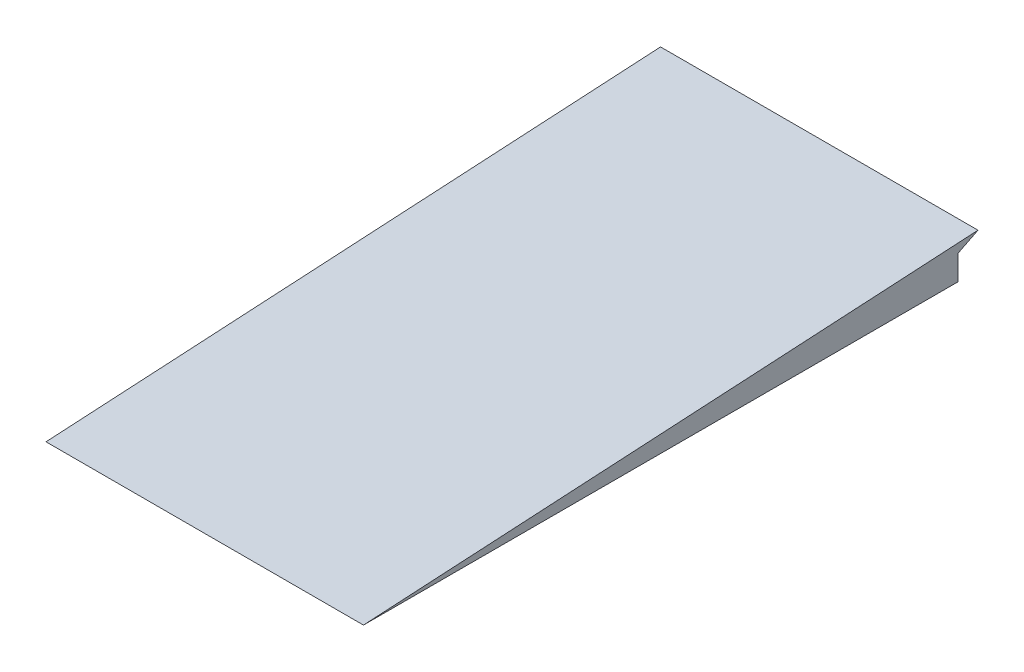
ISO-10303-21;
HEADER;
FILE_DESCRIPTION(('STEP AP214'),'2;1');
FILE_NAME('part.step','',(''),(''),'','','');
FILE_SCHEMA(('AUTOMOTIVE_DESIGN { 1 0 10303 214 1 1 1 1 }'));
ENDSEC;
DATA;
#1=APPLICATION_CONTEXT('core data for automotive mechanical design processes');
#2=APPLICATION_PROTOCOL_DEFINITION('international standard','automotive_design',2000,#1);
#3=PRODUCT_CONTEXT('',#1,'mechanical');
#4=PRODUCT('Part','Part','',(#3));
#5=PRODUCT_RELATED_PRODUCT_CATEGORY('part','',(#4));
#6=PRODUCT_DEFINITION_FORMATION('','',#4);
#7=PRODUCT_DEFINITION_CONTEXT('part definition',#1,'design');
#8=PRODUCT_DEFINITION('design','',#6,#7);
#9=PRODUCT_DEFINITION_SHAPE('','',#8);
#10=(LENGTH_UNIT() NAMED_UNIT(*) SI_UNIT(.MILLI.,.METRE.));
#11=(NAMED_UNIT(*) PLANE_ANGLE_UNIT() SI_UNIT($,.RADIAN.));
#12=(NAMED_UNIT(*) SI_UNIT($,.STERADIAN.) SOLID_ANGLE_UNIT());
#13=UNCERTAINTY_MEASURE_WITH_UNIT(LENGTH_MEASURE(1.E-05),#10,'distance_accuracy_value','');
#14=(GEOMETRIC_REPRESENTATION_CONTEXT(3) GLOBAL_UNCERTAINTY_ASSIGNED_CONTEXT((#13)) GLOBAL_UNIT_ASSIGNED_CONTEXT((#10,
#11,#12)) REPRESENTATION_CONTEXT('',''));
#15=CARTESIAN_POINT('',(0.,0.,0.));
#16=DIRECTION('',(0.,0.,1.));
#17=DIRECTION('',(1.,0.,0.));
#18=AXIS2_PLACEMENT_3D('',#15,#16,#17);
#19=CARTESIAN_POINT('',(812.8,0.,-3045.35301730358));
#20=DIRECTION('',(0.,1.,0.));
#21=DIRECTION('',(0.,0.,1.));
#22=AXIS2_PLACEMENT_3D('',#19,#20,#21);
#23=PLANE('',#22);
#24=DIRECTION('',(0.,0.,-1.));
#25=VECTOR('',#24,1.);
#26=CARTESIAN_POINT('',(-812.8,0.,-3045.35301730358));
#27=LINE('',#26,#25);
#28=CARTESIAN_POINT('',(-812.8,0.,0.));
#29=VERTEX_POINT('',#28);
#30=CARTESIAN_POINT('',(-812.8,0.,-3045.35301730358));
#31=VERTEX_POINT('',#30);
#32=EDGE_CURVE('E89',#29,#31,#27,.T.);
#33=ORIENTED_EDGE('',*,*,#32,.T.);
#34=DIRECTION('',(-1.,0.,0.));
#35=VECTOR('',#34,1.);
#36=CARTESIAN_POINT('',(812.8,0.,-3045.35301730358));
#37=LINE('',#36,#35);
#38=CARTESIAN_POINT('',(812.8,0.,-3045.35301730358));
#39=VERTEX_POINT('',#38);
#40=EDGE_CURVE('E11',#39,#31,#37,.T.);
#41=ORIENTED_EDGE('',*,*,#40,.F.);
#42=DIRECTION('',(0.,0.,-1.));
#43=VECTOR('',#42,1.);
#44=CARTESIAN_POINT('',(812.8,0.,-3045.35301730358));
#45=LINE('',#44,#43);
#46=CARTESIAN_POINT('',(812.8,0.,0.));
#47=VERTEX_POINT('',#46);
#48=EDGE_CURVE('E52',#47,#39,#45,.T.);
#49=ORIENTED_EDGE('',*,*,#48,.F.);
#50=DIRECTION('',(-1.,0.,0.));
#51=VECTOR('',#50,1.);
#52=CARTESIAN_POINT('',(812.8,0.,0.));
#53=LINE('',#52,#51);
#54=EDGE_CURVE('E82',#47,#29,#53,.T.);
#55=ORIENTED_EDGE('',*,*,#54,.T.);
#56=EDGE_LOOP('',(#33,#41,#49,#55));
#57=FACE_BOUND('',#56,.T.);
#58=ADVANCED_FACE('F36',(#57),#23,.F.);
#59=CARTESIAN_POINT('',(812.8,127.,-3045.35301730358));
#60=DIRECTION('',(0.,0.,1.));
#61=DIRECTION('',(1.,0.,0.));
#62=AXIS2_PLACEMENT_3D('',#59,#60,#61);
#63=PLANE('',#62);
#64=DIRECTION('',(0.,1.,0.));
#65=VECTOR('',#64,1.);
#66=CARTESIAN_POINT('',(-812.8,127.,-3045.35301730358));
#67=LINE('',#66,#65);
#68=CARTESIAN_POINT('',(-812.8,127.,-3045.35301730358));
#69=VERTEX_POINT('',#68);
#70=EDGE_CURVE('E65',#31,#69,#67,.T.);
#71=ORIENTED_EDGE('',*,*,#70,.T.);
#72=DIRECTION('',(-1.,0.,0.));
#73=VECTOR('',#72,1.);
#74=CARTESIAN_POINT('',(812.8,127.,-3045.35301730358));
#75=LINE('',#74,#73);
#76=CARTESIAN_POINT('',(812.8,127.,-3045.35301730358));
#77=VERTEX_POINT('',#76);
#78=EDGE_CURVE('E44',#77,#69,#75,.T.);
#79=ORIENTED_EDGE('',*,*,#78,.F.);
#80=DIRECTION('',(0.,1.,0.));
#81=VECTOR('',#80,1.);
#82=CARTESIAN_POINT('',(812.8,127.,-3045.35301730358));
#83=LINE('',#82,#81);
#84=EDGE_CURVE('E75',#39,#77,#83,.T.);
#85=ORIENTED_EDGE('',*,*,#84,.F.);
#86=ORIENTED_EDGE('',*,*,#40,.T.);
#87=EDGE_LOOP('',(#71,#79,#85,#86));
#88=FACE_BOUND('',#87,.T.);
#89=ADVANCED_FACE('F76',(#88),#63,.F.);
#90=CARTESIAN_POINT('',(812.8,0.,0.));
#91=DIRECTION('',(1.,0.,0.));
#92=DIRECTION('',(0.,0.,-1.));
#93=AXIS2_PLACEMENT_3D('',#90,#91,#92);
#94=PLANE('',#93);
#95=ORIENTED_EDGE('',*,*,#48,.T.);
#96=ORIENTED_EDGE('',*,*,#84,.T.);
#97=DIRECTION('',(0.,0.447213595499958,-0.894427190999916));
#98=VECTOR('',#97,1.);
#99=CARTESIAN_POINT('',(812.8,127.,-3045.35301730358));
#100=LINE('',#99,#98);
#101=CARTESIAN_POINT('',(812.8,177.8,-3146.95301730358));
#102=VERTEX_POINT('',#101);
#103=EDGE_CURVE('E101',#77,#102,#100,.T.);
#104=ORIENTED_EDGE('',*,*,#103,.T.);
#105=DIRECTION('',(0.,-0.0564091343866086,0.99840773712835));
#106=VECTOR('',#105,1.);
#107=CARTESIAN_POINT('',(812.8,177.8,-3146.95301730358));
#108=LINE('',#107,#106);
#109=EDGE_CURVE('E87',#102,#47,#108,.T.);
#110=ORIENTED_EDGE('',*,*,#109,.T.);
#111=EDGE_LOOP('',(#95,#96,#104,#110));
#112=FACE_BOUND('',#111,.T.);
#113=ADVANCED_FACE('F85',(#112),#94,.T.);
#114=CARTESIAN_POINT('',(-812.8,0.,0.));
#115=DIRECTION('',(1.,0.,0.));
#116=DIRECTION('',(0.,0.,-1.));
#117=AXIS2_PLACEMENT_3D('',#114,#115,#116);
#118=PLANE('',#117);
#119=ORIENTED_EDGE('',*,*,#32,.F.);
#120=DIRECTION('',(0.,0.0564091343866086,-0.998407737128351));
#121=VECTOR('',#120,1.);
#122=CARTESIAN_POINT('',(-812.8,177.8,-3146.95301730358));
#123=LINE('',#122,#121);
#124=CARTESIAN_POINT('',(-812.800000000001,177.8,-3146.95301730358));
#125=VERTEX_POINT('',#124);
#126=EDGE_CURVE('E94',#29,#125,#123,.T.);
#127=ORIENTED_EDGE('',*,*,#126,.T.);
#128=DIRECTION('',(0.,-0.447213595499958,0.894427190999916));
#129=VECTOR('',#128,1.);
#130=CARTESIAN_POINT('',(-812.8,127.,-3045.35301730358));
#131=LINE('',#130,#129);
#132=EDGE_CURVE('E91',#125,#69,#131,.T.);
#133=ORIENTED_EDGE('',*,*,#132,.T.);
#134=ORIENTED_EDGE('',*,*,#70,.F.);
#135=EDGE_LOOP('',(#119,#127,#133,#134));
#136=FACE_BOUND('',#135,.T.);
#137=ADVANCED_FACE('F108',(#136),#118,.F.);
#138=CARTESIAN_POINT('',(-3964.77178494924,177.8,-3146.95301730358));
#139=DIRECTION('',(0.,0.998407737128351,0.0564091343866086));
#140=DIRECTION('',(0.,-0.0564091343866086,0.998407737128351));
#141=AXIS2_PLACEMENT_3D('',#138,#139,#140);
#142=PLANE('',#141);
#143=ORIENTED_EDGE('',*,*,#126,.F.);
#144=ORIENTED_EDGE('',*,*,#54,.F.);
#145=ORIENTED_EDGE('',*,*,#109,.F.);
#146=DIRECTION('',(1.,0.,0.));
#147=VECTOR('',#146,1.);
#148=CARTESIAN_POINT('',(-3964.77178494924,177.8,-3146.95301730358));
#149=LINE('',#148,#147);
#150=EDGE_CURVE('E103',#125,#102,#149,.T.);
#151=ORIENTED_EDGE('',*,*,#150,.F.);
#152=EDGE_LOOP('',(#143,#144,#145,#151));
#153=FACE_BOUND('',#152,.T.);
#154=ADVANCED_FACE('F110',(#153),#142,.T.);
#155=CARTESIAN_POINT('',(-3964.77178494924,127.,-3045.35301730358));
#156=DIRECTION('',(0.,-0.894427190999916,-0.447213595499958));
#157=DIRECTION('',(0.,0.447213595499958,-0.894427190999916));
#158=AXIS2_PLACEMENT_3D('',#155,#156,#157);
#159=PLANE('',#158);
#160=ORIENTED_EDGE('',*,*,#132,.F.);
#161=ORIENTED_EDGE('',*,*,#150,.T.);
#162=ORIENTED_EDGE('',*,*,#103,.F.);
#163=ORIENTED_EDGE('',*,*,#78,.T.);
#164=EDGE_LOOP('',(#160,#161,#162,#163));
#165=FACE_BOUND('',#164,.T.);
#166=ADVANCED_FACE('F99',(#165),#159,.T.);
#167=CLOSED_SHELL('',(#58,#89,#113,#137,#154,#166));
#168=MANIFOLD_SOLID_BREP('B2',#167);
#169=ADVANCED_BREP_SHAPE_REPRESENTATION('',(#18,#168),#14);
#170=SHAPE_DEFINITION_REPRESENTATION(#9,#169);
ENDSEC;
END-ISO-10303-21;
